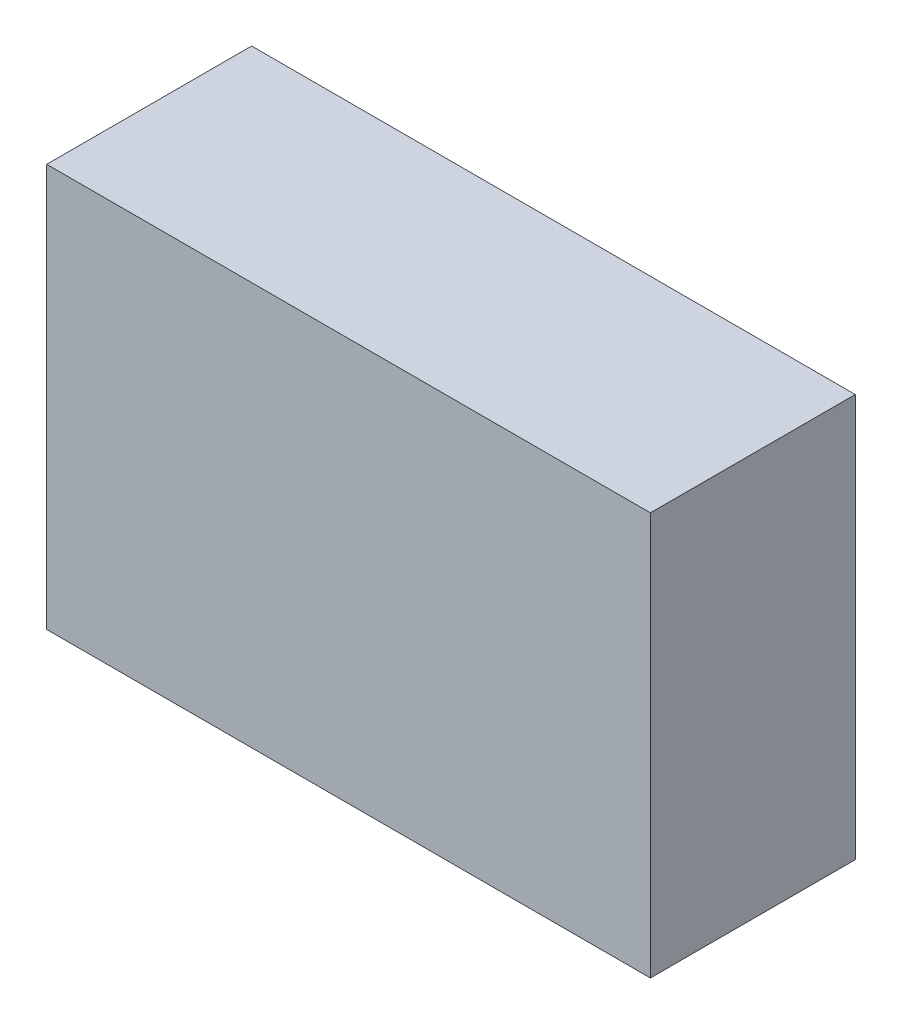
ISO-10303-21;
HEADER;
FILE_DESCRIPTION(('STEP AP214'),'2;1');
FILE_NAME('part.step','',(''),(''),'','','');
FILE_SCHEMA(('AUTOMOTIVE_DESIGN { 1 0 10303 214 1 1 1 1 }'));
ENDSEC;
DATA;
#1=APPLICATION_CONTEXT('core data for automotive mechanical design processes');
#2=APPLICATION_PROTOCOL_DEFINITION('international standard','automotive_design',2000,#1);
#3=PRODUCT_CONTEXT('',#1,'mechanical');
#4=PRODUCT('Part','Part','',(#3));
#5=PRODUCT_RELATED_PRODUCT_CATEGORY('part','',(#4));
#6=PRODUCT_DEFINITION_FORMATION('','',#4);
#7=PRODUCT_DEFINITION_CONTEXT('part definition',#1,'design');
#8=PRODUCT_DEFINITION('design','',#6,#7);
#9=PRODUCT_DEFINITION_SHAPE('','',#8);
#10=(LENGTH_UNIT() NAMED_UNIT(*) SI_UNIT(.MILLI.,.METRE.));
#11=(NAMED_UNIT(*) PLANE_ANGLE_UNIT() SI_UNIT($,.RADIAN.));
#12=(NAMED_UNIT(*) SI_UNIT($,.STERADIAN.) SOLID_ANGLE_UNIT());
#13=UNCERTAINTY_MEASURE_WITH_UNIT(LENGTH_MEASURE(1.E-05),#10,'distance_accuracy_value','');
#14=(GEOMETRIC_REPRESENTATION_CONTEXT(3) GLOBAL_UNCERTAINTY_ASSIGNED_CONTEXT((#13)) GLOBAL_UNIT_ASSIGNED_CONTEXT((#10,
#11,#12)) REPRESENTATION_CONTEXT('',''));
#15=CARTESIAN_POINT('',(0.,0.,0.));
#16=DIRECTION('',(0.,0.,1.));
#17=DIRECTION('',(1.,0.,0.));
#18=AXIS2_PLACEMENT_3D('',#15,#16,#17);
#19=CARTESIAN_POINT('',(-1.473,-0.983,1.));
#20=DIRECTION('',(1.,0.,0.));
#21=DIRECTION('',(0.,0.,-1.));
#22=AXIS2_PLACEMENT_3D('',#19,#20,#21);
#23=PLANE('',#22);
#24=DIRECTION('',(0.,-1.,0.));
#25=VECTOR('',#24,1.);
#26=CARTESIAN_POINT('',(-1.473,-0.983,0.));
#27=LINE('',#26,#25);
#28=CARTESIAN_POINT('',(-1.473,0.983,0.));
#29=VERTEX_POINT('',#28);
#30=CARTESIAN_POINT('',(-1.473,-0.983,0.));
#31=VERTEX_POINT('',#30);
#32=EDGE_CURVE('E96',#29,#31,#27,.T.);
#33=ORIENTED_EDGE('',*,*,#32,.T.);
#34=DIRECTION('',(0.,0.,-1.));
#35=VECTOR('',#34,1.);
#36=CARTESIAN_POINT('',(-1.473,-0.983,1.));
#37=LINE('',#36,#35);
#38=CARTESIAN_POINT('',(-1.473,-0.983,1.));
#39=VERTEX_POINT('',#38);
#40=EDGE_CURVE('E11',#39,#31,#37,.T.);
#41=ORIENTED_EDGE('',*,*,#40,.F.);
#42=DIRECTION('',(0.,-1.,0.));
#43=VECTOR('',#42,1.);
#44=CARTESIAN_POINT('',(-1.473,-0.983,1.));
#45=LINE('',#44,#43);
#46=CARTESIAN_POINT('',(-1.473,0.983,1.));
#47=VERTEX_POINT('',#46);
#48=EDGE_CURVE('E84',#47,#39,#45,.T.);
#49=ORIENTED_EDGE('',*,*,#48,.F.);
#50=DIRECTION('',(0.,0.,-1.));
#51=VECTOR('',#50,1.);
#52=CARTESIAN_POINT('',(-1.473,0.983,1.));
#53=LINE('',#52,#51);
#54=EDGE_CURVE('E92',#47,#29,#53,.T.);
#55=ORIENTED_EDGE('',*,*,#54,.T.);
#56=EDGE_LOOP('',(#33,#41,#49,#55));
#57=FACE_BOUND('',#56,.T.);
#58=ADVANCED_FACE('F33',(#57),#23,.F.);
#59=CARTESIAN_POINT('',(1.473,-0.983,1.));
#60=DIRECTION('',(0.,1.,0.));
#61=DIRECTION('',(0.,0.,1.));
#62=AXIS2_PLACEMENT_3D('',#59,#60,#61);
#63=PLANE('',#62);
#64=DIRECTION('',(1.,0.,0.));
#65=VECTOR('',#64,1.);
#66=CARTESIAN_POINT('',(1.473,-0.983,0.));
#67=LINE('',#66,#65);
#68=CARTESIAN_POINT('',(1.473,-0.983,0.));
#69=VERTEX_POINT('',#68);
#70=EDGE_CURVE('E88',#31,#69,#67,.T.);
#71=ORIENTED_EDGE('',*,*,#70,.T.);
#72=DIRECTION('',(0.,0.,-1.));
#73=VECTOR('',#72,1.);
#74=CARTESIAN_POINT('',(1.473,-0.983,1.));
#75=LINE('',#74,#73);
#76=CARTESIAN_POINT('',(1.473,-0.983,1.));
#77=VERTEX_POINT('',#76);
#78=EDGE_CURVE('E41',#77,#69,#75,.T.);
#79=ORIENTED_EDGE('',*,*,#78,.F.);
#80=DIRECTION('',(1.,0.,0.));
#81=VECTOR('',#80,1.);
#82=CARTESIAN_POINT('',(1.473,-0.983,1.));
#83=LINE('',#82,#81);
#84=EDGE_CURVE('E79',#39,#77,#83,.T.);
#85=ORIENTED_EDGE('',*,*,#84,.F.);
#86=ORIENTED_EDGE('',*,*,#40,.T.);
#87=EDGE_LOOP('',(#71,#79,#85,#86));
#88=FACE_BOUND('',#87,.T.);
#89=ADVANCED_FACE('F87',(#88),#63,.F.);
#90=CARTESIAN_POINT('',(1.473,0.983,1.));
#91=DIRECTION('',(-1.,0.,0.));
#92=DIRECTION('',(0.,0.,1.));
#93=AXIS2_PLACEMENT_3D('',#90,#91,#92);
#94=PLANE('',#93);
#95=DIRECTION('',(0.,1.,0.));
#96=VECTOR('',#95,1.);
#97=CARTESIAN_POINT('',(1.473,0.983,0.));
#98=LINE('',#97,#96);
#99=CARTESIAN_POINT('',(1.473,0.983,0.));
#100=VERTEX_POINT('',#99);
#101=EDGE_CURVE('E66',#69,#100,#98,.T.);
#102=ORIENTED_EDGE('',*,*,#101,.T.);
#103=DIRECTION('',(0.,0.,-1.));
#104=VECTOR('',#103,1.);
#105=CARTESIAN_POINT('',(1.473,0.983,1.));
#106=LINE('',#105,#104);
#107=CARTESIAN_POINT('',(1.473,0.983,1.));
#108=VERTEX_POINT('',#107);
#109=EDGE_CURVE('E89',#108,#100,#106,.T.);
#110=ORIENTED_EDGE('',*,*,#109,.F.);
#111=DIRECTION('',(0.,1.,0.));
#112=VECTOR('',#111,1.);
#113=CARTESIAN_POINT('',(1.473,0.983,1.));
#114=LINE('',#113,#112);
#115=EDGE_CURVE('E82',#77,#108,#114,.T.);
#116=ORIENTED_EDGE('',*,*,#115,.F.);
#117=ORIENTED_EDGE('',*,*,#78,.T.);
#118=EDGE_LOOP('',(#102,#110,#116,#117));
#119=FACE_BOUND('',#118,.T.);
#120=ADVANCED_FACE('F90',(#119),#94,.F.);
#121=CARTESIAN_POINT('',(-1.473,0.983,1.));
#122=DIRECTION('',(0.,-1.,0.));
#123=DIRECTION('',(0.,0.,-1.));
#124=AXIS2_PLACEMENT_3D('',#121,#122,#123);
#125=PLANE('',#124);
#126=DIRECTION('',(-1.,0.,0.));
#127=VECTOR('',#126,1.);
#128=CARTESIAN_POINT('',(-1.473,0.983,0.));
#129=LINE('',#128,#127);
#130=EDGE_CURVE('E72',#100,#29,#129,.T.);
#131=ORIENTED_EDGE('',*,*,#130,.T.);
#132=ORIENTED_EDGE('',*,*,#54,.F.);
#133=DIRECTION('',(-1.,0.,0.));
#134=VECTOR('',#133,1.);
#135=CARTESIAN_POINT('',(-1.473,0.983,1.));
#136=LINE('',#135,#134);
#137=EDGE_CURVE('E49',#108,#47,#136,.T.);
#138=ORIENTED_EDGE('',*,*,#137,.F.);
#139=ORIENTED_EDGE('',*,*,#109,.T.);
#140=EDGE_LOOP('',(#131,#132,#138,#139));
#141=FACE_BOUND('',#140,.T.);
#142=ADVANCED_FACE('F103',(#141),#125,.F.);
#143=CARTESIAN_POINT('',(0.,0.,1.));
#144=DIRECTION('',(0.,0.,-1.));
#145=DIRECTION('',(-1.,0.,0.));
#146=AXIS2_PLACEMENT_3D('',#143,#144,#145);
#147=PLANE('',#146);
#148=ORIENTED_EDGE('',*,*,#48,.T.);
#149=ORIENTED_EDGE('',*,*,#84,.T.);
#150=ORIENTED_EDGE('',*,*,#115,.T.);
#151=ORIENTED_EDGE('',*,*,#137,.T.);
#152=EDGE_LOOP('',(#148,#149,#150,#151));
#153=FACE_BOUND('',#152,.T.);
#154=ADVANCED_FACE('F80',(#153),#147,.F.);
#155=CARTESIAN_POINT('',(0.,0.,0.));
#156=DIRECTION('',(0.,0.,-1.));
#157=DIRECTION('',(-1.,0.,0.));
#158=AXIS2_PLACEMENT_3D('',#155,#156,#157);
#159=PLANE('',#158);
#160=ORIENTED_EDGE('',*,*,#32,.F.);
#161=ORIENTED_EDGE('',*,*,#130,.F.);
#162=ORIENTED_EDGE('',*,*,#101,.F.);
#163=ORIENTED_EDGE('',*,*,#70,.F.);
#164=EDGE_LOOP('',(#160,#161,#162,#163));
#165=FACE_BOUND('',#164,.T.);
#166=ADVANCED_FACE('F106',(#165),#159,.T.);
#167=CLOSED_SHELL('',(#58,#89,#120,#142,#154,#166));
#168=MANIFOLD_SOLID_BREP('B2',#167);
#169=ADVANCED_BREP_SHAPE_REPRESENTATION('',(#18,#168),#14);
#170=SHAPE_DEFINITION_REPRESENTATION(#9,#169);
ENDSEC;
END-ISO-10303-21;
